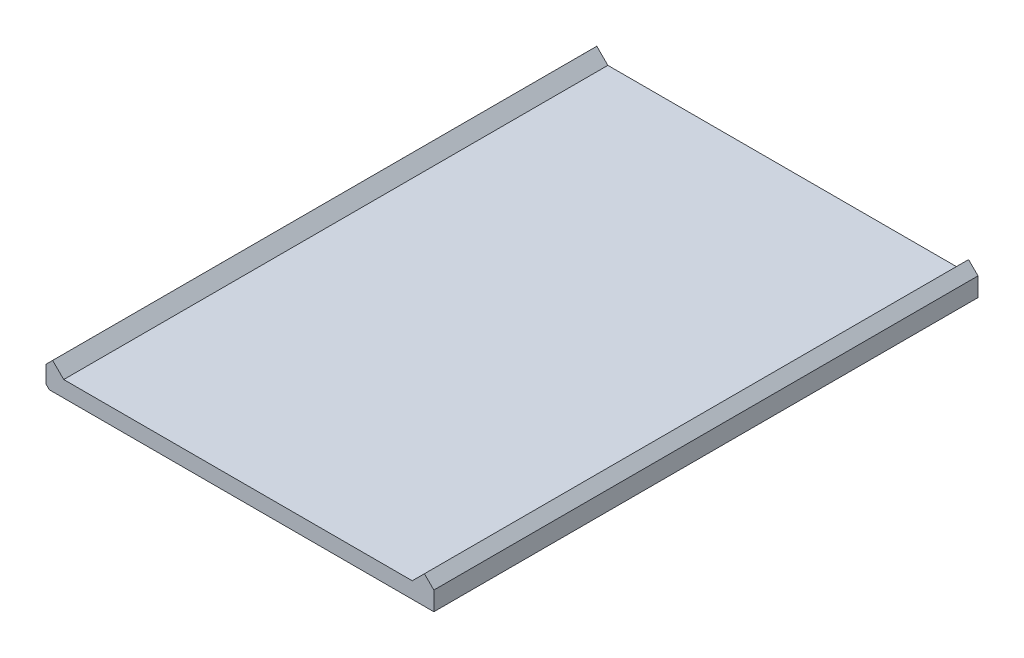
ISO-10303-21;
HEADER;
FILE_DESCRIPTION(('STEP AP214'),'2;1');
FILE_NAME('part.step','',(''),(''),'','','');
FILE_SCHEMA(('AUTOMOTIVE_DESIGN { 1 0 10303 214 1 1 1 1 }'));
ENDSEC;
DATA;
#1=APPLICATION_CONTEXT('core data for automotive mechanical design processes');
#2=APPLICATION_PROTOCOL_DEFINITION('international standard','automotive_design',2000,#1);
#3=PRODUCT_CONTEXT('',#1,'mechanical');
#4=PRODUCT('Part','Part','',(#3));
#5=PRODUCT_RELATED_PRODUCT_CATEGORY('part','',(#4));
#6=PRODUCT_DEFINITION_FORMATION('','',#4);
#7=PRODUCT_DEFINITION_CONTEXT('part definition',#1,'design');
#8=PRODUCT_DEFINITION('design','',#6,#7);
#9=PRODUCT_DEFINITION_SHAPE('','',#8);
#10=(LENGTH_UNIT() NAMED_UNIT(*) SI_UNIT(.MILLI.,.METRE.));
#11=(NAMED_UNIT(*) PLANE_ANGLE_UNIT() SI_UNIT($,.RADIAN.));
#12=(NAMED_UNIT(*) SI_UNIT($,.STERADIAN.) SOLID_ANGLE_UNIT());
#13=UNCERTAINTY_MEASURE_WITH_UNIT(LENGTH_MEASURE(1.E-05),#10,'distance_accuracy_value','');
#14=(GEOMETRIC_REPRESENTATION_CONTEXT(3) GLOBAL_UNCERTAINTY_ASSIGNED_CONTEXT((#13)) GLOBAL_UNIT_ASSIGNED_CONTEXT((#10,
#11,#12)) REPRESENTATION_CONTEXT('',''));
#15=CARTESIAN_POINT('',(0.,0.,0.));
#16=DIRECTION('',(0.,0.,1.));
#17=DIRECTION('',(1.,0.,0.));
#18=AXIS2_PLACEMENT_3D('',#15,#16,#17);
#19=CARTESIAN_POINT('',(-3.44170508,0.23877016,0.));
#20=DIRECTION('',(0.707106781186548,-0.707106781186548,0.));
#21=DIRECTION('',(0.707106781186548,0.707106781186548,0.));
#22=AXIS2_PLACEMENT_3D('',#19,#20,#21);
#23=PLANE('',#22);
#24=DIRECTION('',(0.,0.,-1.));
#25=VECTOR('',#24,1.);
#26=CARTESIAN_POINT('',(-3.5636454,0.11682984,0.));
#27=LINE('',#26,#25);
#28=CARTESIAN_POINT('',(-3.5636454,0.11682984,0.));
#29=VERTEX_POINT('',#28);
#30=CARTESIAN_POINT('',(-3.5636454,0.11682984,10.00000032));
#31=VERTEX_POINT('',#30);
#32=EDGE_CURVE('E100',#29,#31,#27,.F.);
#33=ORIENTED_EDGE('',*,*,#32,.T.);
#34=DIRECTION('',(0.707106781186548,0.707106781186548,0.));
#35=VECTOR('',#34,1.);
#36=CARTESIAN_POINT('',(-3.44170508,0.23877016,10.00000032));
#37=LINE('',#36,#35);
#38=CARTESIAN_POINT('',(-3.44165887646333,0.238792875500175,10.00000032));
#39=VERTEX_POINT('',#38);
#40=EDGE_CURVE('E84',#39,#31,#37,.F.);
#41=ORIENTED_EDGE('',*,*,#40,.F.);
#42=DIRECTION('',(0.,0.,-1.));
#43=VECTOR('',#42,1.);
#44=CARTESIAN_POINT('',(-3.44164789917029,0.23882734082971,0.));
#45=LINE('',#44,#43);
#46=CARTESIAN_POINT('',(-3.44165887646333,0.238792875500175,0.));
#47=VERTEX_POINT('',#46);
#48=EDGE_CURVE('E109',#39,#47,#45,.T.);
#49=ORIENTED_EDGE('',*,*,#48,.T.);
#50=DIRECTION('',(0.707106781186548,0.707106781186548,0.));
#51=VECTOR('',#50,1.);
#52=CARTESIAN_POINT('',(-3.44170508,0.23877016,0.));
#53=LINE('',#52,#51);
#54=EDGE_CURVE('E95',#29,#47,#53,.T.);
#55=ORIENTED_EDGE('',*,*,#54,.F.);
#56=EDGE_LOOP('',(#33,#41,#49,#55));
#57=FACE_BOUND('',#56,.T.);
#58=ADVANCED_FACE('F17',(#57),#23,.F.);
#59=CARTESIAN_POINT('',(3.3905698,0.25947624,0.));
#60=DIRECTION('',(0.707106781186548,-0.707106781186548,0.));
#61=DIRECTION('',(0.707106781186548,0.707106781186548,0.));
#62=AXIS2_PLACEMENT_3D('',#59,#60,#61);
#63=PLANE('',#62);
#64=DIRECTION('',(0.,0.,-1.));
#65=VECTOR('',#64,1.);
#66=CARTESIAN_POINT('',(3.16701932,0.03592576,0.));
#67=LINE('',#66,#65);
#68=CARTESIAN_POINT('',(3.16701932,0.03592576,0.));
#69=VERTEX_POINT('',#68);
#70=CARTESIAN_POINT('',(3.16701932,0.03592576,10.00000032));
#71=VERTEX_POINT('',#70);
#72=EDGE_CURVE('E135',#69,#71,#67,.F.);
#73=ORIENTED_EDGE('',*,*,#72,.T.);
#74=DIRECTION('',(0.707106781186548,0.707106781186548,0.));
#75=VECTOR('',#74,1.);
#76=CARTESIAN_POINT('',(3.3905698,0.25947624,10.00000032));
#77=LINE('',#76,#75);
#78=CARTESIAN_POINT('',(3.3905698,0.25947624,10.00000032));
#79=VERTEX_POINT('',#78);
#80=EDGE_CURVE('E124',#79,#71,#77,.F.);
#81=ORIENTED_EDGE('',*,*,#80,.F.);
#82=DIRECTION('',(0.,0.,1.));
#83=VECTOR('',#82,1.);
#84=CARTESIAN_POINT('',(3.3905698,0.25947624,0.));
#85=LINE('',#84,#83);
#86=CARTESIAN_POINT('',(3.3905698,0.25947624,0.));
#87=VERTEX_POINT('',#86);
#88=EDGE_CURVE('E118',#79,#87,#85,.F.);
#89=ORIENTED_EDGE('',*,*,#88,.T.);
#90=DIRECTION('',(0.707106781186548,0.707106781186548,0.));
#91=VECTOR('',#90,1.);
#92=CARTESIAN_POINT('',(3.3905698,0.25947624,0.));
#93=LINE('',#92,#91);
#94=EDGE_CURVE('E122',#69,#87,#93,.T.);
#95=ORIENTED_EDGE('',*,*,#94,.F.);
#96=EDGE_LOOP('',(#73,#81,#89,#95));
#97=FACE_BOUND('',#96,.T.);
#98=ADVANCED_FACE('F166',(#97),#63,.F.);
#99=CARTESIAN_POINT('',(-3.23808852,0.03592576,0.));
#100=DIRECTION('',(-0.705961506537659,-0.708250203873658,0.));
#101=DIRECTION('',(0.708250203873658,-0.705961506537659,0.));
#102=AXIS2_PLACEMENT_3D('',#99,#100,#101);
#103=PLANE('',#102);
#104=ORIENTED_EDGE('',*,*,#48,.F.);
#105=DIRECTION('',(0.708250203873658,-0.705961506537659,0.));
#106=VECTOR('',#105,1.);
#107=CARTESIAN_POINT('',(-3.23808852,0.03592576,10.00000032));
#108=LINE('',#107,#106);
#109=CARTESIAN_POINT('',(-3.23808852,0.03592576,10.00000032));
#110=VERTEX_POINT('',#109);
#111=EDGE_CURVE('E90',#110,#39,#108,.F.);
#112=ORIENTED_EDGE('',*,*,#111,.F.);
#113=DIRECTION('',(0.,0.,-1.));
#114=VECTOR('',#113,1.);
#115=CARTESIAN_POINT('',(-3.23808852,0.03592576,0.));
#116=LINE('',#115,#114);
#117=CARTESIAN_POINT('',(-3.23808852,0.03592576,0.));
#118=VERTEX_POINT('',#117);
#119=EDGE_CURVE('E132',#110,#118,#116,.T.);
#120=ORIENTED_EDGE('',*,*,#119,.T.);
#121=DIRECTION('',(0.708250203873658,-0.705961506537659,0.));
#122=VECTOR('',#121,1.);
#123=CARTESIAN_POINT('',(-3.23808852,0.03592576,0.));
#124=LINE('',#123,#122);
#125=EDGE_CURVE('E107',#47,#118,#124,.T.);
#126=ORIENTED_EDGE('',*,*,#125,.F.);
#127=EDGE_LOOP('',(#104,#112,#120,#126));
#128=FACE_BOUND('',#127,.T.);
#129=ADVANCED_FACE('F268',(#128),#103,.F.);
#130=CARTESIAN_POINT('',(-3.5636454,0.11682984,0.));
#131=DIRECTION('',(1.,0.,0.));
#132=DIRECTION('',(0.,0.,-1.));
#133=AXIS2_PLACEMENT_3D('',#130,#131,#132);
#134=PLANE('',#133);
#135=DIRECTION('',(0.,0.,1.));
#136=VECTOR('',#135,1.);
#137=CARTESIAN_POINT('',(-3.5636454,-0.19826732,0.));
#138=LINE('',#137,#136);
#139=CARTESIAN_POINT('',(-3.5636454,-0.19826732,0.));
#140=VERTEX_POINT('',#139);
#141=CARTESIAN_POINT('',(-3.5636454,-0.19826732,10.00000032));
#142=VERTEX_POINT('',#141);
#143=EDGE_CURVE('E103',#140,#142,#138,.T.);
#144=ORIENTED_EDGE('',*,*,#143,.T.);
#145=DIRECTION('',(0.,1.,0.));
#146=VECTOR('',#145,1.);
#147=CARTESIAN_POINT('',(-3.5636454,0.11682984,10.00000032));
#148=LINE('',#147,#146);
#149=EDGE_CURVE('E87',#31,#142,#148,.F.);
#150=ORIENTED_EDGE('',*,*,#149,.F.);
#151=ORIENTED_EDGE('',*,*,#32,.F.);
#152=DIRECTION('',(0.,1.,0.));
#153=VECTOR('',#152,1.);
#154=CARTESIAN_POINT('',(-3.5636454,0.11682984,0.));
#155=LINE('',#154,#153);
#156=EDGE_CURVE('E105',#140,#29,#155,.T.);
#157=ORIENTED_EDGE('',*,*,#156,.F.);
#158=EDGE_LOOP('',(#144,#150,#151,#157));
#159=FACE_BOUND('',#158,.T.);
#160=ADVANCED_FACE('F99',(#159),#134,.F.);
#161=CARTESIAN_POINT('',(3.5636454,0.08640064,0.));
#162=DIRECTION('',(-0.707106781186548,-0.707106781186548,0.));
#163=DIRECTION('',(0.707106781186548,-0.707106781186548,0.));
#164=AXIS2_PLACEMENT_3D('',#161,#162,#163);
#165=PLANE('',#164);
#166=ORIENTED_EDGE('',*,*,#88,.F.);
#167=DIRECTION('',(0.707106781186546,-0.707106781186549,0.));
#168=VECTOR('',#167,1.);
#169=CARTESIAN_POINT('',(3.3905698,0.25947624,10.00000032));
#170=LINE('',#169,#168);
#171=CARTESIAN_POINT('',(3.5636454,0.08640064,10.00000032));
#172=VERTEX_POINT('',#171);
#173=EDGE_CURVE('E150',#79,#172,#170,.T.);
#174=ORIENTED_EDGE('',*,*,#173,.T.);
#175=DIRECTION('',(0.,0.,1.));
#176=VECTOR('',#175,1.);
#177=CARTESIAN_POINT('',(3.5636454,0.08640064,0.));
#178=LINE('',#177,#176);
#179=CARTESIAN_POINT('',(3.5636454,0.08640064,0.));
#180=VERTEX_POINT('',#179);
#181=EDGE_CURVE('E141',#172,#180,#178,.F.);
#182=ORIENTED_EDGE('',*,*,#181,.T.);
#183=DIRECTION('',(0.707106781186548,-0.707106781186548,0.));
#184=VECTOR('',#183,1.);
#185=CARTESIAN_POINT('',(3.5636454,0.08640064,0.));
#186=LINE('',#185,#184);
#187=EDGE_CURVE('E161',#87,#180,#186,.T.);
#188=ORIENTED_EDGE('',*,*,#187,.F.);
#189=EDGE_LOOP('',(#166,#174,#182,#188));
#190=FACE_BOUND('',#189,.T.);
#191=ADVANCED_FACE('F170',(#190),#165,.F.);
#192=CARTESIAN_POINT('',(3.16701932,0.03592576,0.));
#193=DIRECTION('',(0.,-1.,0.));
#194=DIRECTION('',(0.,0.,-1.));
#195=AXIS2_PLACEMENT_3D('',#192,#193,#194);
#196=PLANE('',#195);
#197=ORIENTED_EDGE('',*,*,#119,.F.);
#198=DIRECTION('',(-1.,0.,0.));
#199=VECTOR('',#198,1.);
#200=CARTESIAN_POINT('',(-3.44170508,0.03592576,10.00000032));
#201=LINE('',#200,#199);
#202=EDGE_CURVE('E148',#110,#71,#201,.F.);
#203=ORIENTED_EDGE('',*,*,#202,.T.);
#204=ORIENTED_EDGE('',*,*,#72,.F.);
#205=DIRECTION('',(-1.,0.,0.));
#206=VECTOR('',#205,1.);
#207=CARTESIAN_POINT('',(-3.44170508,0.03592576,0.));
#208=LINE('',#207,#206);
#209=EDGE_CURVE('E138',#118,#69,#208,.F.);
#210=ORIENTED_EDGE('',*,*,#209,.F.);
#211=EDGE_LOOP('',(#197,#203,#204,#210));
#212=FACE_BOUND('',#211,.T.);
#213=ADVANCED_FACE('F200',(#212),#196,.F.);
#214=CARTESIAN_POINT('',(-3.5636454,-0.19826732,0.));
#215=DIRECTION('',(0.707106781187048,0.707106781186048,0.));
#216=DIRECTION('',(-0.707106781186048,0.707106781187048,0.));
#217=AXIS2_PLACEMENT_3D('',#214,#215,#216);
#218=PLANE('',#217);
#219=DIRECTION('',(0.,0.,1.));
#220=VECTOR('',#219,1.);
#221=CARTESIAN_POINT('',(-3.50243648,-0.25947624,0.));
#222=LINE('',#221,#220);
#223=CARTESIAN_POINT('',(-3.50243648000002,-0.259476240000022,0.));
#224=VERTEX_POINT('',#223);
#225=CARTESIAN_POINT('',(-3.50243648000002,-0.259476240000022,10.00000032));
#226=VERTEX_POINT('',#225);
#227=EDGE_CURVE('E188',#224,#226,#222,.T.);
#228=ORIENTED_EDGE('',*,*,#227,.T.);
#229=DIRECTION('',(-0.707106781186547,0.707106781186548,0.));
#230=VECTOR('',#229,1.);
#231=CARTESIAN_POINT('',(-3.50243648,-0.25947624,10.00000032));
#232=LINE('',#231,#230);
#233=EDGE_CURVE('E154',#226,#142,#232,.T.);
#234=ORIENTED_EDGE('',*,*,#233,.T.);
#235=ORIENTED_EDGE('',*,*,#143,.F.);
#236=DIRECTION('',(-0.707106781186547,0.707106781186548,0.));
#237=VECTOR('',#236,1.);
#238=CARTESIAN_POINT('',(-3.50243648,-0.25947624,0.));
#239=LINE('',#238,#237);
#240=EDGE_CURVE('E185',#224,#140,#239,.T.);
#241=ORIENTED_EDGE('',*,*,#240,.F.);
#242=EDGE_LOOP('',(#228,#234,#235,#241));
#243=FACE_BOUND('',#242,.T.);
#244=ADVANCED_FACE('F198',(#243),#218,.F.);
#245=CARTESIAN_POINT('',(-3.44170508,0.23877016,10.00000032));
#246=DIRECTION('',(0.,0.,-1.));
#247=DIRECTION('',(-1.,0.,0.));
#248=AXIS2_PLACEMENT_3D('',#245,#246,#247);
#249=PLANE('',#248);
#250=ORIENTED_EDGE('',*,*,#149,.T.);
#251=ORIENTED_EDGE('',*,*,#233,.F.);
#252=DIRECTION('',(1.,0.,0.));
#253=VECTOR('',#252,1.);
#254=CARTESIAN_POINT('',(-3.50243648,-0.25947624,10.00000032));
#255=LINE('',#254,#253);
#256=CARTESIAN_POINT('',(3.5636454,-0.25947624,10.00000032));
#257=VERTEX_POINT('',#256);
#258=EDGE_CURVE('E177',#226,#257,#255,.T.);
#259=ORIENTED_EDGE('',*,*,#258,.T.);
#260=DIRECTION('',(0.,1.,0.));
#261=VECTOR('',#260,1.);
#262=CARTESIAN_POINT('',(3.5636454,-0.25947624,10.00000032));
#263=LINE('',#262,#261);
#264=EDGE_CURVE('E175',#257,#172,#263,.T.);
#265=ORIENTED_EDGE('',*,*,#264,.T.);
#266=ORIENTED_EDGE('',*,*,#173,.F.);
#267=ORIENTED_EDGE('',*,*,#80,.T.);
#268=ORIENTED_EDGE('',*,*,#202,.F.);
#269=ORIENTED_EDGE('',*,*,#111,.T.);
#270=ORIENTED_EDGE('',*,*,#40,.T.);
#271=EDGE_LOOP('',(#250,#251,#259,#265,#266,#267,#268,#269,#270));
#272=FACE_BOUND('',#271,.T.);
#273=ADVANCED_FACE('F86',(#272),#249,.F.);
#274=CARTESIAN_POINT('',(3.5636454,-0.25947624,0.));
#275=DIRECTION('',(-1.,0.,0.));
#276=DIRECTION('',(0.,0.,1.));
#277=AXIS2_PLACEMENT_3D('',#274,#275,#276);
#278=PLANE('',#277);
#279=ORIENTED_EDGE('',*,*,#181,.F.);
#280=ORIENTED_EDGE('',*,*,#264,.F.);
#281=DIRECTION('',(0.,0.,1.));
#282=VECTOR('',#281,1.);
#283=CARTESIAN_POINT('',(3.5636454,-0.25947624,0.));
#284=LINE('',#283,#282);
#285=CARTESIAN_POINT('',(3.5636454,-0.25947624,0.));
#286=VERTEX_POINT('',#285);
#287=EDGE_CURVE('E26',#257,#286,#284,.F.);
#288=ORIENTED_EDGE('',*,*,#287,.T.);
#289=DIRECTION('',(0.,1.,0.));
#290=VECTOR('',#289,1.);
#291=CARTESIAN_POINT('',(3.5636454,0.23877016,0.));
#292=LINE('',#291,#290);
#293=EDGE_CURVE('E34',#180,#286,#292,.F.);
#294=ORIENTED_EDGE('',*,*,#293,.F.);
#295=EDGE_LOOP('',(#279,#280,#288,#294));
#296=FACE_BOUND('',#295,.T.);
#297=ADVANCED_FACE('F192',(#296),#278,.F.);
#298=CARTESIAN_POINT('',(-3.44170508,0.23877016,0.));
#299=DIRECTION('',(0.,0.,-1.));
#300=DIRECTION('',(-1.,0.,0.));
#301=AXIS2_PLACEMENT_3D('',#298,#299,#300);
#302=PLANE('',#301);
#303=ORIENTED_EDGE('',*,*,#156,.T.);
#304=ORIENTED_EDGE('',*,*,#54,.T.);
#305=ORIENTED_EDGE('',*,*,#125,.T.);
#306=ORIENTED_EDGE('',*,*,#209,.T.);
#307=ORIENTED_EDGE('',*,*,#94,.T.);
#308=ORIENTED_EDGE('',*,*,#187,.T.);
#309=ORIENTED_EDGE('',*,*,#293,.T.);
#310=DIRECTION('',(1.,0.,0.));
#311=VECTOR('',#310,1.);
#312=CARTESIAN_POINT('',(-3.50243648,-0.25947624,0.));
#313=LINE('',#312,#311);
#314=EDGE_CURVE('E11',#286,#224,#313,.F.);
#315=ORIENTED_EDGE('',*,*,#314,.T.);
#316=ORIENTED_EDGE('',*,*,#240,.T.);
#317=EDGE_LOOP('',(#303,#304,#305,#306,#307,#308,#309,#315,#316));
#318=FACE_BOUND('',#317,.T.);
#319=ADVANCED_FACE('F196',(#318),#302,.T.);
#320=CARTESIAN_POINT('',(-3.50243648,-0.25947624,0.));
#321=DIRECTION('',(0.,1.,0.));
#322=DIRECTION('',(0.,0.,1.));
#323=AXIS2_PLACEMENT_3D('',#320,#321,#322);
#324=PLANE('',#323);
#325=ORIENTED_EDGE('',*,*,#287,.F.);
#326=ORIENTED_EDGE('',*,*,#258,.F.);
#327=ORIENTED_EDGE('',*,*,#227,.F.);
#328=ORIENTED_EDGE('',*,*,#314,.F.);
#329=EDGE_LOOP('',(#325,#326,#327,#328));
#330=FACE_BOUND('',#329,.T.);
#331=ADVANCED_FACE('F194',(#330),#324,.F.);
#332=CLOSED_SHELL('',(#58,#98,#129,#160,#191,#213,#244,#273,#297,#319,#331));
#333=MANIFOLD_SOLID_BREP('B1',#332);
#334=ADVANCED_BREP_SHAPE_REPRESENTATION('',(#18,#333),#14);
#335=SHAPE_DEFINITION_REPRESENTATION(#9,#334);
ENDSEC;
END-ISO-10303-21;
